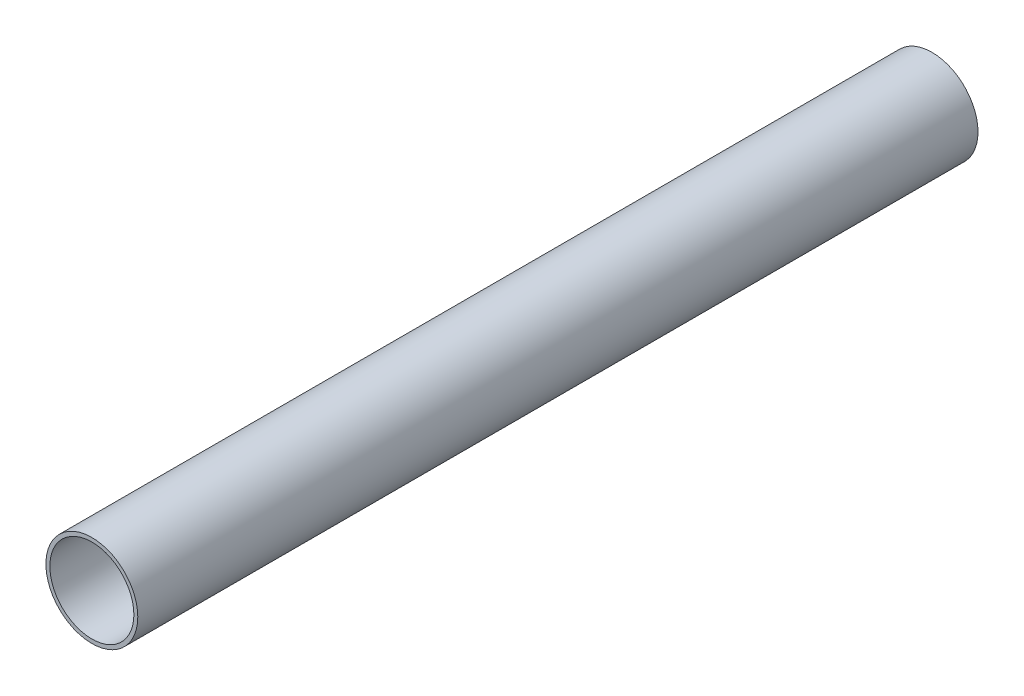
ISO-10303-21;
HEADER;
FILE_DESCRIPTION(('STEP AP214'),'2;1');
FILE_NAME('part.step','',(''),(''),'','','');
FILE_SCHEMA(('AUTOMOTIVE_DESIGN { 1 0 10303 214 1 1 1 1 }'));
ENDSEC;
DATA;
#1=APPLICATION_CONTEXT('core data for automotive mechanical design processes');
#2=APPLICATION_PROTOCOL_DEFINITION('international standard','automotive_design',2000,#1);
#3=PRODUCT_CONTEXT('',#1,'mechanical');
#4=PRODUCT('Part','Part','',(#3));
#5=PRODUCT_RELATED_PRODUCT_CATEGORY('part','',(#4));
#6=PRODUCT_DEFINITION_FORMATION('','',#4);
#7=PRODUCT_DEFINITION_CONTEXT('part definition',#1,'design');
#8=PRODUCT_DEFINITION('design','',#6,#7);
#9=PRODUCT_DEFINITION_SHAPE('','',#8);
#10=(LENGTH_UNIT() NAMED_UNIT(*) SI_UNIT(.MILLI.,.METRE.));
#11=(NAMED_UNIT(*) PLANE_ANGLE_UNIT() SI_UNIT($,.RADIAN.));
#12=(NAMED_UNIT(*) SI_UNIT($,.STERADIAN.) SOLID_ANGLE_UNIT());
#13=UNCERTAINTY_MEASURE_WITH_UNIT(LENGTH_MEASURE(1.E-05),#10,'distance_accuracy_value','');
#14=(GEOMETRIC_REPRESENTATION_CONTEXT(3) GLOBAL_UNCERTAINTY_ASSIGNED_CONTEXT((#13)) GLOBAL_UNIT_ASSIGNED_CONTEXT((#10,
#11,#12)) REPRESENTATION_CONTEXT('',''));
#15=CARTESIAN_POINT('',(0.,0.,0.));
#16=DIRECTION('',(0.,0.,1.));
#17=DIRECTION('',(1.,0.,0.));
#18=AXIS2_PLACEMENT_3D('',#15,#16,#17);
#19=CARTESIAN_POINT('',(0.,0.,-2000.));
#20=DIRECTION('',(0.,0.,1.));
#21=DIRECTION('',(1.,0.,0.));
#22=AXIS2_PLACEMENT_3D('',#19,#20,#21);
#23=CYLINDRICAL_SURFACE('',#22,109.35);
#24=CARTESIAN_POINT('',(0.,0.,-2000.));
#25=DIRECTION('',(0.,0.,1.));
#26=DIRECTION('',(1.,0.,0.));
#27=AXIS2_PLACEMENT_3D('',#24,#25,#26);
#28=CIRCLE('',#27,109.35);
#29=CARTESIAN_POINT('',(109.35,0.,-2000.));
#30=VERTEX_POINT('',#29);
#31=EDGE_CURVE('E10',#30,#30,#28,.T.);
#32=ORIENTED_EDGE('',*,*,#31,.T.);
#33=EDGE_LOOP('',(#32));
#34=FACE_BOUND('',#33,.T.);
#35=CARTESIAN_POINT('',(0.,0.,0.));
#36=DIRECTION('',(0.,0.,1.));
#37=DIRECTION('',(1.,0.,0.));
#38=AXIS2_PLACEMENT_3D('',#35,#36,#37);
#39=CIRCLE('',#38,109.35);
#40=CARTESIAN_POINT('',(109.35,0.,0.));
#41=VERTEX_POINT('',#40);
#42=EDGE_CURVE('E40',#41,#41,#39,.T.);
#43=ORIENTED_EDGE('',*,*,#42,.F.);
#44=EDGE_LOOP('',(#43));
#45=FACE_BOUND('',#44,.T.);
#46=ADVANCED_FACE('F37',(#34,#45),#23,.T.);
#47=CARTESIAN_POINT('',(0.,0.,-2000.));
#48=DIRECTION('',(0.,0.,1.));
#49=DIRECTION('',(1.,0.,0.));
#50=AXIS2_PLACEMENT_3D('',#47,#48,#49);
#51=PLANE('',#50);
#52=CARTESIAN_POINT('',(0.,0.,-2000.));
#53=DIRECTION('',(0.,0.,1.));
#54=DIRECTION('',(1.,0.,0.));
#55=AXIS2_PLACEMENT_3D('',#52,#53,#54);
#56=CIRCLE('',#55,100.);
#57=CARTESIAN_POINT('',(100.,0.,-2000.));
#58=VERTEX_POINT('',#57);
#59=EDGE_CURVE('E49',#58,#58,#56,.T.);
#60=ORIENTED_EDGE('',*,*,#59,.T.);
#61=EDGE_LOOP('',(#60));
#62=FACE_BOUND('',#61,.T.);
#63=ORIENTED_EDGE('',*,*,#31,.F.);
#64=EDGE_LOOP('',(#63));
#65=FACE_BOUND('',#64,.T.);
#66=ADVANCED_FACE('F59',(#62,#65),#51,.F.);
#67=CARTESIAN_POINT('',(0.,0.,0.));
#68=DIRECTION('',(0.,0.,1.));
#69=DIRECTION('',(1.,0.,0.));
#70=AXIS2_PLACEMENT_3D('',#67,#68,#69);
#71=PLANE('',#70);
#72=CARTESIAN_POINT('',(0.,0.,0.));
#73=DIRECTION('',(0.,0.,1.));
#74=DIRECTION('',(1.,0.,0.));
#75=AXIS2_PLACEMENT_3D('',#72,#73,#74);
#76=CIRCLE('',#75,100.);
#77=CARTESIAN_POINT('',(100.,0.,0.));
#78=VERTEX_POINT('',#77);
#79=EDGE_CURVE('E51',#78,#78,#76,.T.);
#80=ORIENTED_EDGE('',*,*,#79,.F.);
#81=EDGE_LOOP('',(#80));
#82=FACE_BOUND('',#81,.T.);
#83=ORIENTED_EDGE('',*,*,#42,.T.);
#84=EDGE_LOOP('',(#83));
#85=FACE_BOUND('',#84,.T.);
#86=ADVANCED_FACE('F65',(#82,#85),#71,.T.);
#87=CARTESIAN_POINT('',(0.,0.,-2000.));
#88=DIRECTION('',(0.,0.,1.));
#89=DIRECTION('',(1.,0.,0.));
#90=AXIS2_PLACEMENT_3D('',#87,#88,#89);
#91=CYLINDRICAL_SURFACE('',#90,100.);
#92=ORIENTED_EDGE('',*,*,#59,.F.);
#93=EDGE_LOOP('',(#92));
#94=FACE_BOUND('',#93,.T.);
#95=ORIENTED_EDGE('',*,*,#79,.T.);
#96=EDGE_LOOP('',(#95));
#97=FACE_BOUND('',#96,.T.);
#98=ADVANCED_FACE('F62',(#94,#97),#91,.F.);
#99=CLOSED_SHELL('',(#46,#66,#86,#98));
#100=MANIFOLD_SOLID_BREP('B2',#99);
#101=ADVANCED_BREP_SHAPE_REPRESENTATION('',(#18,#100),#14);
#102=SHAPE_DEFINITION_REPRESENTATION(#9,#101);
ENDSEC;
END-ISO-10303-21;
